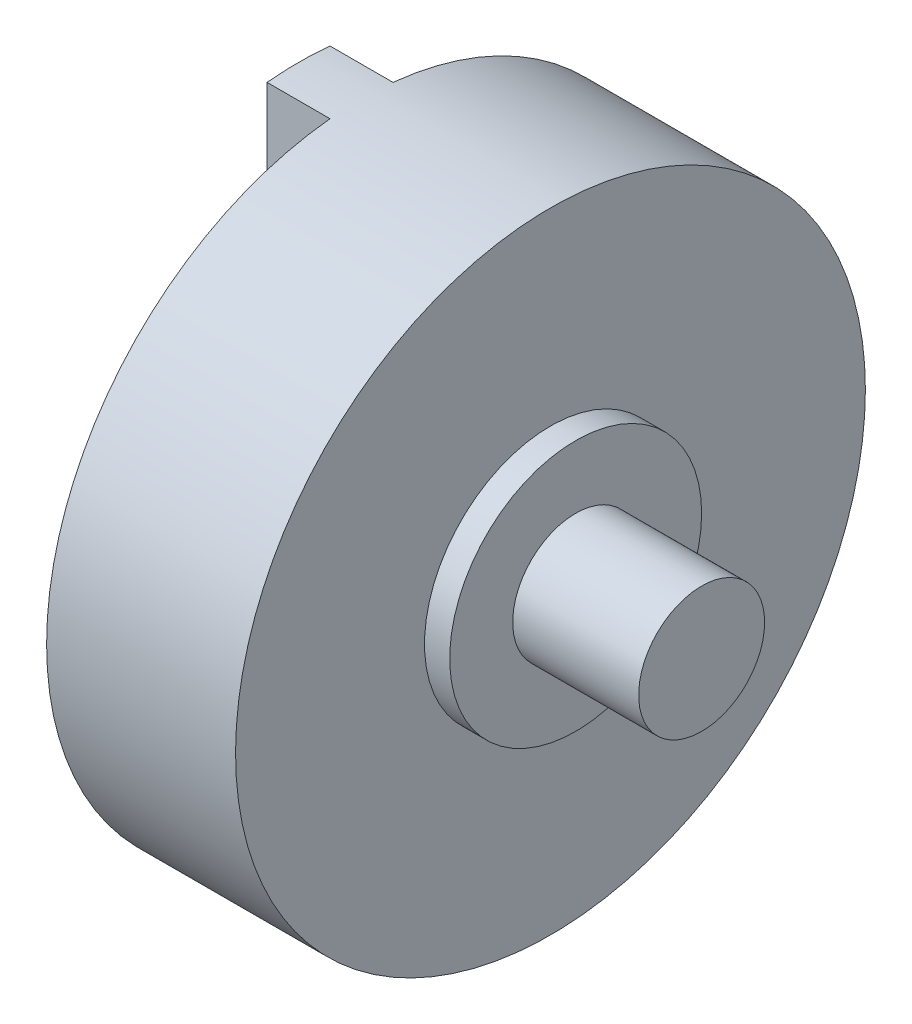
ISO-10303-21;
HEADER;
FILE_DESCRIPTION(('STEP AP214'),'2;1');
FILE_NAME('part.step','',(''),(''),'','','');
FILE_SCHEMA(('AUTOMOTIVE_DESIGN { 1 0 10303 214 1 1 1 1 }'));
ENDSEC;
DATA;
#1=APPLICATION_CONTEXT('core data for automotive mechanical design processes');
#2=APPLICATION_PROTOCOL_DEFINITION('international standard','automotive_design',2000,#1);
#3=PRODUCT_CONTEXT('',#1,'mechanical');
#4=PRODUCT('Part','Part','',(#3));
#5=PRODUCT_RELATED_PRODUCT_CATEGORY('part','',(#4));
#6=PRODUCT_DEFINITION_FORMATION('','',#4);
#7=PRODUCT_DEFINITION_CONTEXT('part definition',#1,'design');
#8=PRODUCT_DEFINITION('design','',#6,#7);
#9=PRODUCT_DEFINITION_SHAPE('','',#8);
#10=(LENGTH_UNIT() NAMED_UNIT(*) SI_UNIT(.MILLI.,.METRE.));
#11=(NAMED_UNIT(*) PLANE_ANGLE_UNIT() SI_UNIT($,.RADIAN.));
#12=(NAMED_UNIT(*) SI_UNIT($,.STERADIAN.) SOLID_ANGLE_UNIT());
#13=UNCERTAINTY_MEASURE_WITH_UNIT(LENGTH_MEASURE(1.E-05),#10,'distance_accuracy_value','');
#14=(GEOMETRIC_REPRESENTATION_CONTEXT(3) GLOBAL_UNCERTAINTY_ASSIGNED_CONTEXT((#13)) GLOBAL_UNIT_ASSIGNED_CONTEXT((#10,
#11,#12)) REPRESENTATION_CONTEXT('',''));
#15=CARTESIAN_POINT('',(0.,0.,0.));
#16=DIRECTION('',(0.,0.,1.));
#17=DIRECTION('',(1.,0.,0.));
#18=AXIS2_PLACEMENT_3D('',#15,#16,#17);
#19=CARTESIAN_POINT('',(7.5,0.,0.));
#20=DIRECTION('',(1.,0.,0.));
#21=DIRECTION('',(0.,0.,-1.));
#22=AXIS2_PLACEMENT_3D('',#19,#20,#21);
#23=PLANE('',#22);
#24=CARTESIAN_POINT('',(7.5,0.,0.));
#25=DIRECTION('',(1.,0.,0.));
#26=DIRECTION('',(0.,0.,-1.));
#27=AXIS2_PLACEMENT_3D('',#24,#25,#26);
#28=CIRCLE('',#27,25.);
#29=CARTESIAN_POINT('',(7.5,0.,-25.));
#30=VERTEX_POINT('',#29);
#31=EDGE_CURVE('E11',#30,#30,#28,.T.);
#32=ORIENTED_EDGE('',*,*,#31,.T.);
#33=EDGE_LOOP('',(#32));
#34=FACE_BOUND('',#33,.T.);
#35=CARTESIAN_POINT('',(7.5,0.,0.));
#36=DIRECTION('',(1.,0.,0.));
#37=DIRECTION('',(0.,0.,-1.));
#38=AXIS2_PLACEMENT_3D('',#35,#36,#37);
#39=CIRCLE('',#38,10.);
#40=CARTESIAN_POINT('',(7.5,0.,-10.));
#41=VERTEX_POINT('',#40);
#42=EDGE_CURVE('E129',#41,#41,#39,.T.);
#43=ORIENTED_EDGE('',*,*,#42,.F.);
#44=EDGE_LOOP('',(#43));
#45=FACE_BOUND('',#44,.T.);
#46=ADVANCED_FACE('F35',(#34,#45),#23,.T.);
#47=CARTESIAN_POINT('',(-7.5,0.,0.));
#48=DIRECTION('',(1.,0.,0.));
#49=DIRECTION('',(0.,0.,-1.));
#50=AXIS2_PLACEMENT_3D('',#47,#48,#49);
#51=PLANE('',#50);
#52=DIRECTION('',(0.,-1.,0.));
#53=VECTOR('',#52,1.);
#54=CARTESIAN_POINT('',(-7.5,24.8746859276655,-2.5));
#55=LINE('',#54,#53);
#56=CARTESIAN_POINT('',(-7.5,24.8746859276655,-2.5));
#57=VERTEX_POINT('',#56);
#58=CARTESIAN_POINT('',(-7.5,-24.8746859276655,-2.5));
#59=VERTEX_POINT('',#58);
#60=EDGE_CURVE('E97',#57,#59,#55,.T.);
#61=ORIENTED_EDGE('',*,*,#60,.F.);
#62=CARTESIAN_POINT('',(-7.5,0.,0.));
#63=DIRECTION('',(1.,0.,0.));
#64=DIRECTION('',(0.,0.,-1.));
#65=AXIS2_PLACEMENT_3D('',#62,#63,#64);
#66=CIRCLE('',#65,25.);
#67=EDGE_CURVE('E51',#59,#57,#66,.T.);
#68=ORIENTED_EDGE('',*,*,#67,.F.);
#69=EDGE_LOOP('',(#61,#68));
#70=FACE_BOUND('',#69,.T.);
#71=ADVANCED_FACE('F143',(#70),#51,.F.);
#72=DIRECTION('',(0.,1.,0.));
#73=VECTOR('',#72,1.);
#74=CARTESIAN_POINT('',(-7.5,24.8746859276655,2.5));
#75=LINE('',#74,#73);
#76=CARTESIAN_POINT('',(-7.5,-24.8746859276655,2.5));
#77=VERTEX_POINT('',#76);
#78=CARTESIAN_POINT('',(-7.5,24.8746859276655,2.49999999999999));
#79=VERTEX_POINT('',#78);
#80=EDGE_CURVE('E58',#77,#79,#75,.T.);
#81=ORIENTED_EDGE('',*,*,#80,.F.);
#82=EDGE_CURVE('E44',#79,#77,#66,.T.);
#83=ORIENTED_EDGE('',*,*,#82,.F.);
#84=EDGE_LOOP('',(#81,#83));
#85=FACE_BOUND('',#84,.T.);
#86=ADVANCED_FACE('F145',(#85),#51,.F.);
#87=CARTESIAN_POINT('',(7.5,0.,0.));
#88=DIRECTION('',(-1.,0.,0.));
#89=DIRECTION('',(0.,0.,1.));
#90=AXIS2_PLACEMENT_3D('',#87,#88,#89);
#91=CYLINDRICAL_SURFACE('',#90,25.);
#92=ORIENTED_EDGE('',*,*,#31,.F.);
#93=EDGE_LOOP('',(#92));
#94=FACE_BOUND('',#93,.T.);
#95=ORIENTED_EDGE('',*,*,#67,.T.);
#96=DIRECTION('',(1.,0.,0.));
#97=VECTOR('',#96,1.);
#98=CARTESIAN_POINT('',(-12.5,24.8746859276655,-2.5));
#99=LINE('',#98,#97);
#100=CARTESIAN_POINT('',(-12.5,24.8746859276655,-2.5));
#101=VERTEX_POINT('',#100);
#102=EDGE_CURVE('E103',#101,#57,#99,.T.);
#103=ORIENTED_EDGE('',*,*,#102,.F.);
#104=CARTESIAN_POINT('',(-12.5,0.,0.));
#105=DIRECTION('',(-1.,0.,0.));
#106=DIRECTION('',(0.,0.,1.));
#107=AXIS2_PLACEMENT_3D('',#104,#105,#106);
#108=CIRCLE('',#107,25.);
#109=CARTESIAN_POINT('',(-12.5,24.8746859276655,2.49999999999999));
#110=VERTEX_POINT('',#109);
#111=EDGE_CURVE('E87',#110,#101,#108,.T.);
#112=ORIENTED_EDGE('',*,*,#111,.F.);
#113=DIRECTION('',(1.,0.,0.));
#114=VECTOR('',#113,1.);
#115=CARTESIAN_POINT('',(-12.5,24.8746859276655,2.49999999999999));
#116=LINE('',#115,#114);
#117=EDGE_CURVE('E84',#110,#79,#116,.T.);
#118=ORIENTED_EDGE('',*,*,#117,.T.);
#119=ORIENTED_EDGE('',*,*,#82,.T.);
#120=DIRECTION('',(1.,0.,0.));
#121=VECTOR('',#120,1.);
#122=CARTESIAN_POINT('',(-12.5,-24.8746859276655,2.5));
#123=LINE('',#122,#121);
#124=CARTESIAN_POINT('',(-12.5,-24.8746859276655,2.5));
#125=VERTEX_POINT('',#124);
#126=EDGE_CURVE('E82',#125,#77,#123,.T.);
#127=ORIENTED_EDGE('',*,*,#126,.F.);
#128=CARTESIAN_POINT('',(-12.5,0.,0.));
#129=DIRECTION('',(-1.,0.,0.));
#130=DIRECTION('',(0.,0.,1.));
#131=AXIS2_PLACEMENT_3D('',#128,#129,#130);
#132=CIRCLE('',#131,25.);
#133=CARTESIAN_POINT('',(-12.5,-24.8746859276655,-2.5));
#134=VERTEX_POINT('',#133);
#135=EDGE_CURVE('E88',#134,#125,#132,.T.);
#136=ORIENTED_EDGE('',*,*,#135,.F.);
#137=DIRECTION('',(1.,0.,0.));
#138=VECTOR('',#137,1.);
#139=CARTESIAN_POINT('',(-12.5,-24.8746859276655,-2.5));
#140=LINE('',#139,#138);
#141=EDGE_CURVE('E112',#134,#59,#140,.T.);
#142=ORIENTED_EDGE('',*,*,#141,.T.);
#143=EDGE_LOOP('',(#95,#103,#112,#118,#119,#127,#136,#142));
#144=FACE_BOUND('',#143,.T.);
#145=ADVANCED_FACE('F37',(#94,#144),#91,.T.);
#146=CARTESIAN_POINT('',(-12.5,24.8746859276655,2.5));
#147=DIRECTION('',(0.,0.,-1.));
#148=DIRECTION('',(0.,1.,0.));
#149=AXIS2_PLACEMENT_3D('',#146,#147,#148);
#150=PLANE('',#149);
#151=ORIENTED_EDGE('',*,*,#80,.T.);
#152=ORIENTED_EDGE('',*,*,#117,.F.);
#153=DIRECTION('',(0.,1.,0.));
#154=VECTOR('',#153,1.);
#155=CARTESIAN_POINT('',(-12.5,24.8746859276655,2.5));
#156=LINE('',#155,#154);
#157=EDGE_CURVE('E78',#125,#110,#156,.T.);
#158=ORIENTED_EDGE('',*,*,#157,.F.);
#159=ORIENTED_EDGE('',*,*,#126,.T.);
#160=EDGE_LOOP('',(#151,#152,#158,#159));
#161=FACE_BOUND('',#160,.T.);
#162=ADVANCED_FACE('F80',(#161),#150,.F.);
#163=CARTESIAN_POINT('',(-12.5,24.8746859276655,-2.5));
#164=DIRECTION('',(0.,0.,1.));
#165=DIRECTION('',(0.,-1.,0.));
#166=AXIS2_PLACEMENT_3D('',#163,#164,#165);
#167=PLANE('',#166);
#168=ORIENTED_EDGE('',*,*,#60,.T.);
#169=ORIENTED_EDGE('',*,*,#141,.F.);
#170=DIRECTION('',(0.,-1.,0.));
#171=VECTOR('',#170,1.);
#172=CARTESIAN_POINT('',(-12.5,24.8746859276655,-2.5));
#173=LINE('',#172,#171);
#174=EDGE_CURVE('E93',#101,#134,#173,.T.);
#175=ORIENTED_EDGE('',*,*,#174,.F.);
#176=ORIENTED_EDGE('',*,*,#102,.T.);
#177=EDGE_LOOP('',(#168,#169,#175,#176));
#178=FACE_BOUND('',#177,.T.);
#179=ADVANCED_FACE('F142',(#178),#167,.F.);
#180=CARTESIAN_POINT('',(-12.5,0.,0.));
#181=DIRECTION('',(-1.,0.,0.));
#182=DIRECTION('',(0.,0.,1.));
#183=AXIS2_PLACEMENT_3D('',#180,#181,#182);
#184=PLANE('',#183);
#185=ORIENTED_EDGE('',*,*,#135,.T.);
#186=ORIENTED_EDGE('',*,*,#157,.T.);
#187=ORIENTED_EDGE('',*,*,#111,.T.);
#188=ORIENTED_EDGE('',*,*,#174,.T.);
#189=EDGE_LOOP('',(#185,#186,#187,#188));
#190=FACE_BOUND('',#189,.T.);
#191=ADVANCED_FACE('F91',(#190),#184,.T.);
#192=CARTESIAN_POINT('',(9.5,0.,0.));
#193=DIRECTION('',(1.,0.,0.));
#194=DIRECTION('',(0.,0.,-1.));
#195=AXIS2_PLACEMENT_3D('',#192,#193,#194);
#196=PLANE('',#195);
#197=CARTESIAN_POINT('',(9.5,0.,0.));
#198=DIRECTION('',(1.,0.,0.));
#199=DIRECTION('',(0.,0.,-1.));
#200=AXIS2_PLACEMENT_3D('',#197,#198,#199);
#201=CIRCLE('',#200,10.);
#202=CARTESIAN_POINT('',(9.5,0.,-10.));
#203=VERTEX_POINT('',#202);
#204=EDGE_CURVE('E125',#203,#203,#201,.T.);
#205=ORIENTED_EDGE('',*,*,#204,.T.);
#206=EDGE_LOOP('',(#205));
#207=FACE_BOUND('',#206,.T.);
#208=CARTESIAN_POINT('',(9.5,0.,0.));
#209=DIRECTION('',(1.,0.,0.));
#210=DIRECTION('',(0.,0.,-1.));
#211=AXIS2_PLACEMENT_3D('',#208,#209,#210);
#212=CIRCLE('',#211,5.);
#213=CARTESIAN_POINT('',(9.5,0.,-5.));
#214=VERTEX_POINT('',#213);
#215=EDGE_CURVE('E39',#214,#214,#212,.T.);
#216=ORIENTED_EDGE('',*,*,#215,.F.);
#217=EDGE_LOOP('',(#216));
#218=FACE_BOUND('',#217,.T.);
#219=ADVANCED_FACE('F167',(#207,#218),#196,.T.);
#220=CARTESIAN_POINT('',(9.5,0.,0.));
#221=DIRECTION('',(-1.,0.,0.));
#222=DIRECTION('',(0.,0.,1.));
#223=AXIS2_PLACEMENT_3D('',#220,#221,#222);
#224=CYLINDRICAL_SURFACE('',#223,10.);
#225=ORIENTED_EDGE('',*,*,#204,.F.);
#226=EDGE_LOOP('',(#225));
#227=FACE_BOUND('',#226,.T.);
#228=ORIENTED_EDGE('',*,*,#42,.T.);
#229=EDGE_LOOP('',(#228));
#230=FACE_BOUND('',#229,.T.);
#231=ADVANCED_FACE('F159',(#227,#230),#224,.T.);
#232=CARTESIAN_POINT('',(19.5,0.,0.));
#233=DIRECTION('',(1.,0.,0.));
#234=DIRECTION('',(0.,0.,-1.));
#235=AXIS2_PLACEMENT_3D('',#232,#233,#234);
#236=PLANE('',#235);
#237=CARTESIAN_POINT('',(19.5,0.,0.));
#238=DIRECTION('',(1.,0.,0.));
#239=DIRECTION('',(0.,0.,-1.));
#240=AXIS2_PLACEMENT_3D('',#237,#238,#239);
#241=CIRCLE('',#240,5.);
#242=CARTESIAN_POINT('',(19.5,0.,-5.));
#243=VERTEX_POINT('',#242);
#244=EDGE_CURVE('E99',#243,#243,#241,.T.);
#245=ORIENTED_EDGE('',*,*,#244,.T.);
#246=EDGE_LOOP('',(#245));
#247=FACE_BOUND('',#246,.T.);
#248=ADVANCED_FACE('F156',(#247),#236,.T.);
#249=CARTESIAN_POINT('',(19.5,0.,0.));
#250=DIRECTION('',(-1.,0.,0.));
#251=DIRECTION('',(0.,0.,1.));
#252=AXIS2_PLACEMENT_3D('',#249,#250,#251);
#253=CYLINDRICAL_SURFACE('',#252,5.);
#254=ORIENTED_EDGE('',*,*,#215,.T.);
#255=EDGE_LOOP('',(#254));
#256=FACE_BOUND('',#255,.T.);
#257=ORIENTED_EDGE('',*,*,#244,.F.);
#258=EDGE_LOOP('',(#257));
#259=FACE_BOUND('',#258,.T.);
#260=ADVANCED_FACE('F153',(#256,#259),#253,.T.);
#261=CLOSED_SHELL('',(#46,#71,#86,#145,#162,#179,#191,#219,#231,#248,#260));
#262=MANIFOLD_SOLID_BREP('B2',#261);
#263=ADVANCED_BREP_SHAPE_REPRESENTATION('',(#18,#262),#14);
#264=SHAPE_DEFINITION_REPRESENTATION(#9,#263);
ENDSEC;
END-ISO-10303-21;
